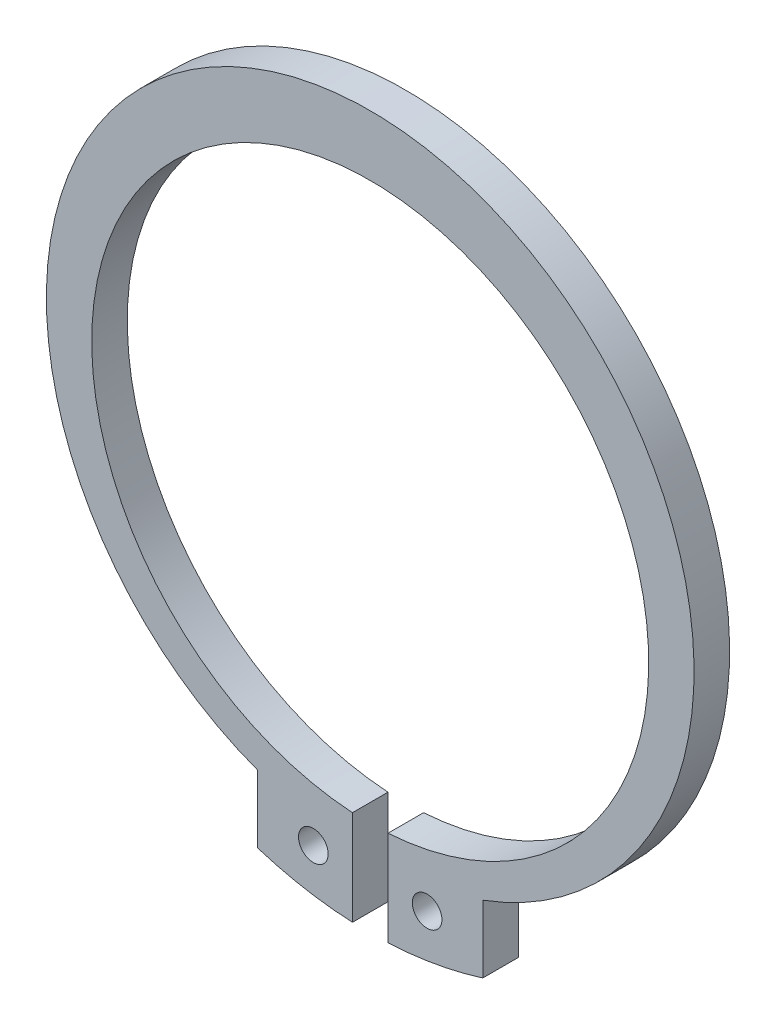
ISO-10303-21;
HEADER;
FILE_DESCRIPTION(('STEP AP214'),'2;1');
FILE_NAME('part.step','',(''),(''),'','','');
FILE_SCHEMA(('AUTOMOTIVE_DESIGN { 1 0 10303 214 1 1 1 1 }'));
ENDSEC;
DATA;
#1=APPLICATION_CONTEXT('core data for automotive mechanical design processes');
#2=APPLICATION_PROTOCOL_DEFINITION('international standard','automotive_design',2000,#1);
#3=PRODUCT_CONTEXT('',#1,'mechanical');
#4=PRODUCT('Part','Part','',(#3));
#5=PRODUCT_RELATED_PRODUCT_CATEGORY('part','',(#4));
#6=PRODUCT_DEFINITION_FORMATION('','',#4);
#7=PRODUCT_DEFINITION_CONTEXT('part definition',#1,'design');
#8=PRODUCT_DEFINITION('design','',#6,#7);
#9=PRODUCT_DEFINITION_SHAPE('','',#8);
#10=(LENGTH_UNIT() NAMED_UNIT(*) SI_UNIT(.MILLI.,.METRE.));
#11=(NAMED_UNIT(*) PLANE_ANGLE_UNIT() SI_UNIT($,.RADIAN.));
#12=(NAMED_UNIT(*) SI_UNIT($,.STERADIAN.) SOLID_ANGLE_UNIT());
#13=UNCERTAINTY_MEASURE_WITH_UNIT(LENGTH_MEASURE(1.E-05),#10,'distance_accuracy_value','');
#14=(GEOMETRIC_REPRESENTATION_CONTEXT(3) GLOBAL_UNCERTAINTY_ASSIGNED_CONTEXT((#13)) GLOBAL_UNIT_ASSIGNED_CONTEXT((#10,
#11,#12)) REPRESENTATION_CONTEXT('',''));
#15=CARTESIAN_POINT('',(0.,0.,0.));
#16=DIRECTION('',(0.,0.,1.));
#17=DIRECTION('',(1.,0.,0.));
#18=AXIS2_PLACEMENT_3D('',#15,#16,#17);
#19=CARTESIAN_POINT('',(-1.5,-31.4642654451045,3.));
#20=DIRECTION('',(-1.,0.,0.));
#21=DIRECTION('',(0.,-1.,0.));
#22=AXIS2_PLACEMENT_3D('',#19,#20,#21);
#23=PLANE('',#22);
#24=DIRECTION('',(0.,1.,0.));
#25=VECTOR('',#24,1.);
#26=CARTESIAN_POINT('',(-1.5,-31.4642654451045,0.));
#27=LINE('',#26,#25);
#28=CARTESIAN_POINT('',(-1.5,-31.4642654451045,0.));
#29=VERTEX_POINT('',#28);
#30=CARTESIAN_POINT('',(-1.49999999999999,-23.4520787991171,0.));
#31=VERTEX_POINT('',#30);
#32=EDGE_CURVE('E114',#29,#31,#27,.T.);
#33=ORIENTED_EDGE('',*,*,#32,.T.);
#34=DIRECTION('',(0.,0.,-1.));
#35=VECTOR('',#34,1.);
#36=CARTESIAN_POINT('',(-1.49999999999999,-23.4520787991171,3.));
#37=LINE('',#36,#35);
#38=CARTESIAN_POINT('',(-1.49999999999999,-23.4520787991171,3.));
#39=VERTEX_POINT('',#38);
#40=EDGE_CURVE('E13',#39,#31,#37,.T.);
#41=ORIENTED_EDGE('',*,*,#40,.F.);
#42=DIRECTION('',(0.,1.,0.));
#43=VECTOR('',#42,1.);
#44=CARTESIAN_POINT('',(-1.5,-31.4642654451045,3.));
#45=LINE('',#44,#43);
#46=CARTESIAN_POINT('',(-1.5,-31.4642654451045,3.));
#47=VERTEX_POINT('',#46);
#48=EDGE_CURVE('E144',#47,#39,#45,.T.);
#49=ORIENTED_EDGE('',*,*,#48,.F.);
#50=DIRECTION('',(0.,0.,-1.));
#51=VECTOR('',#50,1.);
#52=CARTESIAN_POINT('',(-1.5,-31.4642654451045,3.));
#53=LINE('',#52,#51);
#54=EDGE_CURVE('E167',#47,#29,#53,.T.);
#55=ORIENTED_EDGE('',*,*,#54,.T.);
#56=EDGE_LOOP('',(#33,#41,#49,#55));
#57=FACE_BOUND('',#56,.T.);
#58=ADVANCED_FACE('F27',(#57),#23,.F.);
#59=CARTESIAN_POINT('',(0.,0.,3.));
#60=DIRECTION('',(0.,0.,-1.));
#61=DIRECTION('',(-1.,0.,0.));
#62=AXIS2_PLACEMENT_3D('',#59,#60,#61);
#63=CYLINDRICAL_SURFACE('',#62,23.5);
#64=CARTESIAN_POINT('',(0.,0.,0.));
#65=DIRECTION('',(0.,0.,1.));
#66=DIRECTION('',(1.,0.,0.));
#67=AXIS2_PLACEMENT_3D('',#64,#65,#66);
#68=CIRCLE('',#67,23.5);
#69=CARTESIAN_POINT('',(1.5,-23.4520787991171,0.));
#70=VERTEX_POINT('',#69);
#71=EDGE_CURVE('E107',#70,#31,#68,.T.);
#72=ORIENTED_EDGE('',*,*,#71,.F.);
#73=DIRECTION('',(0.,0.,-1.));
#74=VECTOR('',#73,1.);
#75=CARTESIAN_POINT('',(1.5,-23.4520787991171,3.));
#76=LINE('',#75,#74);
#77=CARTESIAN_POINT('',(1.5,-23.4520787991171,3.));
#78=VERTEX_POINT('',#77);
#79=EDGE_CURVE('E36',#78,#70,#76,.T.);
#80=ORIENTED_EDGE('',*,*,#79,.F.);
#81=CARTESIAN_POINT('',(0.,0.,3.));
#82=DIRECTION('',(0.,0.,1.));
#83=DIRECTION('',(1.,0.,0.));
#84=AXIS2_PLACEMENT_3D('',#81,#82,#83);
#85=CIRCLE('',#84,23.5);
#86=EDGE_CURVE('E148',#78,#39,#85,.T.);
#87=ORIENTED_EDGE('',*,*,#86,.T.);
#88=ORIENTED_EDGE('',*,*,#40,.T.);
#89=EDGE_LOOP('',(#72,#80,#87,#88));
#90=FACE_BOUND('',#89,.T.);
#91=ADVANCED_FACE('F108',(#90),#63,.F.);
#92=CARTESIAN_POINT('',(1.5,-31.4642654451045,3.));
#93=DIRECTION('',(-1.,0.,0.));
#94=DIRECTION('',(0.,-1.,0.));
#95=AXIS2_PLACEMENT_3D('',#92,#93,#94);
#96=PLANE('',#95);
#97=DIRECTION('',(0.,1.,0.));
#98=VECTOR('',#97,1.);
#99=CARTESIAN_POINT('',(1.5,-31.4642654451045,0.));
#100=LINE('',#99,#98);
#101=CARTESIAN_POINT('',(1.5,-31.4642654451045,0.));
#102=VERTEX_POINT('',#101);
#103=EDGE_CURVE('E97',#102,#70,#100,.T.);
#104=ORIENTED_EDGE('',*,*,#103,.F.);
#105=DIRECTION('',(0.,0.,-1.));
#106=VECTOR('',#105,1.);
#107=CARTESIAN_POINT('',(1.5,-31.4642654451045,3.));
#108=LINE('',#107,#106);
#109=CARTESIAN_POINT('',(1.5,-31.4642654451045,3.));
#110=VERTEX_POINT('',#109);
#111=EDGE_CURVE('E104',#110,#102,#108,.T.);
#112=ORIENTED_EDGE('',*,*,#111,.F.);
#113=DIRECTION('',(0.,1.,0.));
#114=VECTOR('',#113,1.);
#115=CARTESIAN_POINT('',(1.5,-31.4642654451045,3.));
#116=LINE('',#115,#114);
#117=EDGE_CURVE('E99',#110,#78,#116,.T.);
#118=ORIENTED_EDGE('',*,*,#117,.T.);
#119=ORIENTED_EDGE('',*,*,#79,.T.);
#120=EDGE_LOOP('',(#104,#112,#118,#119));
#121=FACE_BOUND('',#120,.T.);
#122=ADVANCED_FACE('F95',(#121),#96,.T.);
#123=CARTESIAN_POINT('',(0.,0.,3.));
#124=DIRECTION('',(0.,0.,-1.));
#125=DIRECTION('',(-1.,0.,0.));
#126=AXIS2_PLACEMENT_3D('',#123,#124,#125);
#127=CYLINDRICAL_SURFACE('',#126,31.5);
#128=CARTESIAN_POINT('',(0.,0.,0.));
#129=DIRECTION('',(0.,0.,1.));
#130=DIRECTION('',(1.,0.,0.));
#131=AXIS2_PLACEMENT_3D('',#128,#129,#130);
#132=CIRCLE('',#131,31.5);
#133=CARTESIAN_POINT('',(9.49999999999999,-30.0333148353625,0.));
#134=VERTEX_POINT('',#133);
#135=EDGE_CURVE('E119',#102,#134,#132,.T.);
#136=ORIENTED_EDGE('',*,*,#135,.T.);
#137=DIRECTION('',(0.,0.,-1.));
#138=VECTOR('',#137,1.);
#139=CARTESIAN_POINT('',(9.49999999999999,-30.0333148353625,3.));
#140=LINE('',#139,#138);
#141=CARTESIAN_POINT('',(9.49999999999999,-30.0333148353625,3.));
#142=VERTEX_POINT('',#141);
#143=EDGE_CURVE('E182',#142,#134,#140,.T.);
#144=ORIENTED_EDGE('',*,*,#143,.F.);
#145=CARTESIAN_POINT('',(0.,0.,3.));
#146=DIRECTION('',(0.,0.,1.));
#147=DIRECTION('',(1.,0.,0.));
#148=AXIS2_PLACEMENT_3D('',#145,#146,#147);
#149=CIRCLE('',#148,31.5);
#150=EDGE_CURVE('E153',#110,#142,#149,.T.);
#151=ORIENTED_EDGE('',*,*,#150,.F.);
#152=ORIENTED_EDGE('',*,*,#111,.T.);
#153=EDGE_LOOP('',(#136,#144,#151,#152));
#154=FACE_BOUND('',#153,.T.);
#155=ADVANCED_FACE('F241',(#154),#127,.T.);
#156=CARTESIAN_POINT('',(9.49999999999999,-30.0333148353625,3.));
#157=DIRECTION('',(-1.,0.,0.));
#158=DIRECTION('',(0.,0.,1.));
#159=AXIS2_PLACEMENT_3D('',#156,#157,#158);
#160=PLANE('',#159);
#161=DIRECTION('',(0.,1.,0.));
#162=VECTOR('',#161,1.);
#163=CARTESIAN_POINT('',(9.49999999999999,-30.0333148353625,0.));
#164=LINE('',#163,#162);
#165=CARTESIAN_POINT('',(9.49999999999999,-24.3454142238177,0.));
#166=VERTEX_POINT('',#165);
#167=EDGE_CURVE('E127',#134,#166,#164,.T.);
#168=ORIENTED_EDGE('',*,*,#167,.T.);
#169=DIRECTION('',(0.,0.,-1.));
#170=VECTOR('',#169,1.);
#171=CARTESIAN_POINT('',(9.49999999999999,-24.3454142238177,3.));
#172=LINE('',#171,#170);
#173=CARTESIAN_POINT('',(9.49999999999999,-24.3454142238177,3.));
#174=VERTEX_POINT('',#173);
#175=EDGE_CURVE('E178',#174,#166,#172,.T.);
#176=ORIENTED_EDGE('',*,*,#175,.F.);
#177=DIRECTION('',(0.,1.,0.));
#178=VECTOR('',#177,1.);
#179=CARTESIAN_POINT('',(9.49999999999999,-30.0333148353625,3.));
#180=LINE('',#179,#178);
#181=EDGE_CURVE('E156',#142,#174,#180,.T.);
#182=ORIENTED_EDGE('',*,*,#181,.F.);
#183=ORIENTED_EDGE('',*,*,#143,.T.);
#184=EDGE_LOOP('',(#168,#176,#182,#183));
#185=FACE_BOUND('',#184,.T.);
#186=ADVANCED_FACE('F236',(#185),#160,.F.);
#187=CARTESIAN_POINT('',(0.,1.275,3.));
#188=DIRECTION('',(0.,0.,-1.));
#189=DIRECTION('',(-1.,0.,0.));
#190=AXIS2_PLACEMENT_3D('',#187,#188,#189);
#191=CYLINDRICAL_SURFACE('',#190,27.325);
#192=CARTESIAN_POINT('',(0.,1.275,0.));
#193=DIRECTION('',(0.,0.,1.));
#194=DIRECTION('',(1.,0.,0.));
#195=AXIS2_PLACEMENT_3D('',#192,#193,#194);
#196=CIRCLE('',#195,27.325);
#197=CARTESIAN_POINT('',(-9.5,-24.3454142238177,0.));
#198=VERTEX_POINT('',#197);
#199=EDGE_CURVE('E133',#166,#198,#196,.T.);
#200=ORIENTED_EDGE('',*,*,#199,.T.);
#201=DIRECTION('',(0.,0.,-1.));
#202=VECTOR('',#201,1.);
#203=CARTESIAN_POINT('',(-9.5,-24.3454142238177,3.));
#204=LINE('',#203,#202);
#205=CARTESIAN_POINT('',(-9.5,-24.3454142238177,3.));
#206=VERTEX_POINT('',#205);
#207=EDGE_CURVE('E175',#206,#198,#204,.T.);
#208=ORIENTED_EDGE('',*,*,#207,.F.);
#209=CARTESIAN_POINT('',(0.,1.275,3.));
#210=DIRECTION('',(0.,0.,1.));
#211=DIRECTION('',(1.,0.,0.));
#212=AXIS2_PLACEMENT_3D('',#209,#210,#211);
#213=CIRCLE('',#212,27.325);
#214=EDGE_CURVE('E159',#174,#206,#213,.T.);
#215=ORIENTED_EDGE('',*,*,#214,.F.);
#216=ORIENTED_EDGE('',*,*,#175,.T.);
#217=EDGE_LOOP('',(#200,#208,#215,#216));
#218=FACE_BOUND('',#217,.T.);
#219=ADVANCED_FACE('F233',(#218),#191,.T.);
#220=CARTESIAN_POINT('',(-9.5,-30.0333148353624,3.));
#221=DIRECTION('',(-1.,0.,0.));
#222=DIRECTION('',(0.,0.,1.));
#223=AXIS2_PLACEMENT_3D('',#220,#221,#222);
#224=PLANE('',#223);
#225=DIRECTION('',(0.,1.,0.));
#226=VECTOR('',#225,1.);
#227=CARTESIAN_POINT('',(-9.5,-30.0333148353624,0.));
#228=LINE('',#227,#226);
#229=CARTESIAN_POINT('',(-9.5,-30.0333148353624,0.));
#230=VERTEX_POINT('',#229);
#231=EDGE_CURVE('E137',#230,#198,#228,.T.);
#232=ORIENTED_EDGE('',*,*,#231,.F.);
#233=DIRECTION('',(0.,0.,-1.));
#234=VECTOR('',#233,1.);
#235=CARTESIAN_POINT('',(-9.5,-30.0333148353624,3.));
#236=LINE('',#235,#234);
#237=CARTESIAN_POINT('',(-9.5,-30.0333148353624,3.));
#238=VERTEX_POINT('',#237);
#239=EDGE_CURVE('E52',#238,#230,#236,.T.);
#240=ORIENTED_EDGE('',*,*,#239,.F.);
#241=DIRECTION('',(0.,1.,0.));
#242=VECTOR('',#241,1.);
#243=CARTESIAN_POINT('',(-9.5,-30.0333148353624,3.));
#244=LINE('',#243,#242);
#245=EDGE_CURVE('E162',#238,#206,#244,.T.);
#246=ORIENTED_EDGE('',*,*,#245,.T.);
#247=ORIENTED_EDGE('',*,*,#207,.T.);
#248=EDGE_LOOP('',(#232,#240,#246,#247));
#249=FACE_BOUND('',#248,.T.);
#250=ADVANCED_FACE('F229',(#249),#224,.T.);
#251=CARTESIAN_POINT('',(0.,0.,3.));
#252=DIRECTION('',(0.,0.,-1.));
#253=DIRECTION('',(-1.,0.,0.));
#254=AXIS2_PLACEMENT_3D('',#251,#252,#253);
#255=CYLINDRICAL_SURFACE('',#254,31.5);
#256=CARTESIAN_POINT('',(0.,0.,0.));
#257=DIRECTION('',(0.,0.,1.));
#258=DIRECTION('',(1.,0.,0.));
#259=AXIS2_PLACEMENT_3D('',#256,#257,#258);
#260=CIRCLE('',#259,31.5);
#261=EDGE_CURVE('E141',#230,#29,#260,.T.);
#262=ORIENTED_EDGE('',*,*,#261,.T.);
#263=ORIENTED_EDGE('',*,*,#54,.F.);
#264=CARTESIAN_POINT('',(0.,0.,3.));
#265=DIRECTION('',(0.,0.,1.));
#266=DIRECTION('',(1.,0.,0.));
#267=AXIS2_PLACEMENT_3D('',#264,#265,#266);
#268=CIRCLE('',#267,31.5);
#269=EDGE_CURVE('E44',#238,#47,#268,.T.);
#270=ORIENTED_EDGE('',*,*,#269,.F.);
#271=ORIENTED_EDGE('',*,*,#239,.T.);
#272=EDGE_LOOP('',(#262,#263,#270,#271));
#273=FACE_BOUND('',#272,.T.);
#274=ADVANCED_FACE('F244',(#273),#255,.T.);
#275=CARTESIAN_POINT('',(0.,0.,3.));
#276=DIRECTION('',(0.,0.,1.));
#277=DIRECTION('',(1.,0.,0.));
#278=AXIS2_PLACEMENT_3D('',#275,#276,#277);
#279=PLANE('',#278);
#280=CARTESIAN_POINT('',(4.8,-27.5,3.));
#281=DIRECTION('',(0.,0.,1.));
#282=DIRECTION('',(1.,0.,0.));
#283=AXIS2_PLACEMENT_3D('',#280,#281,#282);
#284=CIRCLE('',#283,1.25);
#285=CARTESIAN_POINT('',(6.05,-27.5,3.));
#286=VERTEX_POINT('',#285);
#287=EDGE_CURVE('E189',#286,#286,#284,.T.);
#288=ORIENTED_EDGE('',*,*,#287,.F.);
#289=EDGE_LOOP('',(#288));
#290=FACE_BOUND('',#289,.T.);
#291=CARTESIAN_POINT('',(-4.8,-27.5,3.));
#292=DIRECTION('',(0.,0.,1.));
#293=DIRECTION('',(1.,0.,0.));
#294=AXIS2_PLACEMENT_3D('',#291,#292,#293);
#295=CIRCLE('',#294,1.25);
#296=CARTESIAN_POINT('',(-3.55,-27.5,3.));
#297=VERTEX_POINT('',#296);
#298=EDGE_CURVE('E147',#297,#297,#295,.T.);
#299=ORIENTED_EDGE('',*,*,#298,.F.);
#300=EDGE_LOOP('',(#299));
#301=FACE_BOUND('',#300,.T.);
#302=ORIENTED_EDGE('',*,*,#48,.T.);
#303=ORIENTED_EDGE('',*,*,#86,.F.);
#304=ORIENTED_EDGE('',*,*,#117,.F.);
#305=ORIENTED_EDGE('',*,*,#150,.T.);
#306=ORIENTED_EDGE('',*,*,#181,.T.);
#307=ORIENTED_EDGE('',*,*,#214,.T.);
#308=ORIENTED_EDGE('',*,*,#245,.F.);
#309=ORIENTED_EDGE('',*,*,#269,.T.);
#310=EDGE_LOOP('',(#302,#303,#304,#305,#306,#307,#308,#309));
#311=FACE_BOUND('',#310,.T.);
#312=ADVANCED_FACE('F242',(#290,#301,#311),#279,.T.);
#313=CARTESIAN_POINT('',(0.,0.,0.));
#314=DIRECTION('',(0.,0.,1.));
#315=DIRECTION('',(1.,0.,0.));
#316=AXIS2_PLACEMENT_3D('',#313,#314,#315);
#317=PLANE('',#316);
#318=CARTESIAN_POINT('',(4.8,-27.5,0.));
#319=DIRECTION('',(0.,0.,1.));
#320=DIRECTION('',(1.,0.,0.));
#321=AXIS2_PLACEMENT_3D('',#318,#319,#320);
#322=CIRCLE('',#321,1.25);
#323=CARTESIAN_POINT('',(6.05,-27.5,0.));
#324=VERTEX_POINT('',#323);
#325=EDGE_CURVE('E30',#324,#324,#322,.T.);
#326=ORIENTED_EDGE('',*,*,#325,.T.);
#327=EDGE_LOOP('',(#326));
#328=FACE_BOUND('',#327,.T.);
#329=CARTESIAN_POINT('',(-4.8,-27.5,0.));
#330=DIRECTION('',(0.,0.,1.));
#331=DIRECTION('',(1.,0.,0.));
#332=AXIS2_PLACEMENT_3D('',#329,#330,#331);
#333=CIRCLE('',#332,1.25);
#334=CARTESIAN_POINT('',(-3.55,-27.5,0.));
#335=VERTEX_POINT('',#334);
#336=EDGE_CURVE('E186',#335,#335,#333,.T.);
#337=ORIENTED_EDGE('',*,*,#336,.T.);
#338=EDGE_LOOP('',(#337));
#339=FACE_BOUND('',#338,.T.);
#340=ORIENTED_EDGE('',*,*,#32,.F.);
#341=ORIENTED_EDGE('',*,*,#261,.F.);
#342=ORIENTED_EDGE('',*,*,#231,.T.);
#343=ORIENTED_EDGE('',*,*,#199,.F.);
#344=ORIENTED_EDGE('',*,*,#167,.F.);
#345=ORIENTED_EDGE('',*,*,#135,.F.);
#346=ORIENTED_EDGE('',*,*,#103,.T.);
#347=ORIENTED_EDGE('',*,*,#71,.T.);
#348=EDGE_LOOP('',(#340,#341,#342,#343,#344,#345,#346,#347));
#349=FACE_BOUND('',#348,.T.);
#350=ADVANCED_FACE('F117',(#328,#339,#349),#317,.F.);
#351=CARTESIAN_POINT('',(-4.8,-27.5,-3.));
#352=DIRECTION('',(0.,0.,1.));
#353=DIRECTION('',(0.,1.,0.));
#354=AXIS2_PLACEMENT_3D('',#351,#352,#353);
#355=CYLINDRICAL_SURFACE('',#354,1.25);
#356=ORIENTED_EDGE('',*,*,#298,.T.);
#357=EDGE_LOOP('',(#356));
#358=FACE_BOUND('',#357,.T.);
#359=ORIENTED_EDGE('',*,*,#336,.F.);
#360=EDGE_LOOP('',(#359));
#361=FACE_BOUND('',#360,.T.);
#362=ADVANCED_FACE('F212',(#358,#361),#355,.F.);
#363=CARTESIAN_POINT('',(4.8,-27.5,-3.));
#364=DIRECTION('',(0.,0.,1.));
#365=DIRECTION('',(0.,1.,0.));
#366=AXIS2_PLACEMENT_3D('',#363,#364,#365);
#367=CYLINDRICAL_SURFACE('',#366,1.25);
#368=ORIENTED_EDGE('',*,*,#287,.T.);
#369=EDGE_LOOP('',(#368));
#370=FACE_BOUND('',#369,.T.);
#371=ORIENTED_EDGE('',*,*,#325,.F.);
#372=EDGE_LOOP('',(#371));
#373=FACE_BOUND('',#372,.T.);
#374=ADVANCED_FACE('F210',(#370,#373),#367,.F.);
#375=CLOSED_SHELL('',(#58,#91,#122,#155,#186,#219,#250,#274,#312,#350,#362,#374));
#376=MANIFOLD_SOLID_BREP('B1',#375);
#377=ADVANCED_BREP_SHAPE_REPRESENTATION('',(#18,#376),#14);
#378=SHAPE_DEFINITION_REPRESENTATION(#9,#377);
ENDSEC;
END-ISO-10303-21;
